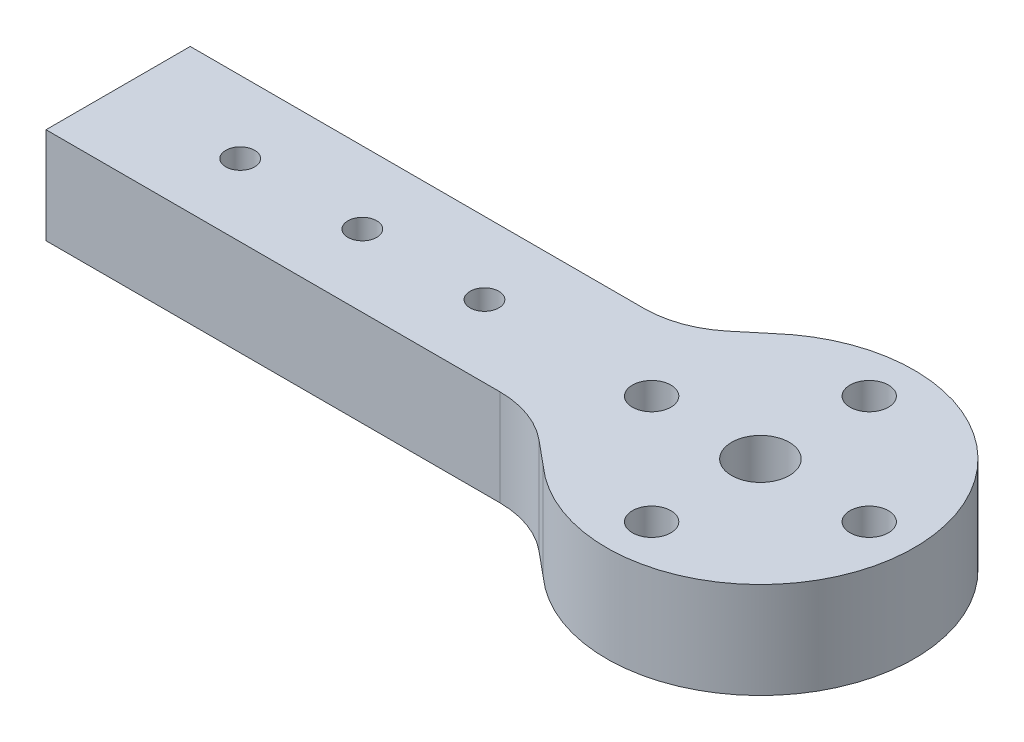
ISO-10303-21;
HEADER;
FILE_DESCRIPTION(('STEP AP214'),'2;1');
FILE_NAME('part.step','',(''),(''),'','','');
FILE_SCHEMA(('AUTOMOTIVE_DESIGN { 1 0 10303 214 1 1 1 1 }'));
ENDSEC;
DATA;
#1=APPLICATION_CONTEXT('core data for automotive mechanical design processes');
#2=APPLICATION_PROTOCOL_DEFINITION('international standard','automotive_design',2000,#1);
#3=PRODUCT_CONTEXT('',#1,'mechanical');
#4=PRODUCT('Part','Part','',(#3));
#5=PRODUCT_RELATED_PRODUCT_CATEGORY('part','',(#4));
#6=PRODUCT_DEFINITION_FORMATION('','',#4);
#7=PRODUCT_DEFINITION_CONTEXT('part definition',#1,'design');
#8=PRODUCT_DEFINITION('design','',#6,#7);
#9=PRODUCT_DEFINITION_SHAPE('','',#8);
#10=(LENGTH_UNIT() NAMED_UNIT(*) SI_UNIT(.MILLI.,.METRE.));
#11=(NAMED_UNIT(*) PLANE_ANGLE_UNIT() SI_UNIT($,.RADIAN.));
#12=(NAMED_UNIT(*) SI_UNIT($,.STERADIAN.) SOLID_ANGLE_UNIT());
#13=UNCERTAINTY_MEASURE_WITH_UNIT(LENGTH_MEASURE(1.E-05),#10,'distance_accuracy_value','');
#14=(GEOMETRIC_REPRESENTATION_CONTEXT(3) GLOBAL_UNCERTAINTY_ASSIGNED_CONTEXT((#13)) GLOBAL_UNIT_ASSIGNED_CONTEXT((#10,
#11,#12)) REPRESENTATION_CONTEXT('',''));
#15=CARTESIAN_POINT('',(0.,0.,0.));
#16=DIRECTION('',(0.,0.,1.));
#17=DIRECTION('',(1.,0.,0.));
#18=AXIS2_PLACEMENT_3D('',#15,#16,#17);
#19=CARTESIAN_POINT('',(20.7132446022363,10.,-24.9638603553524));
#20=DIRECTION('',(0.638546032386932,0.,-0.769583630623019));
#21=DIRECTION('',(-0.769583630623019,0.,-0.638546032386932));
#22=AXIS2_PLACEMENT_3D('',#19,#20,#21);
#23=PLANE('',#22);
#24=DIRECTION('',(0.769583630623019,0.,0.638546032386932));
#25=VECTOR('',#24,1.);
#26=CARTESIAN_POINT('',(20.7132446022363,0.,-24.9638603553524));
#27=LINE('',#26,#25);
#28=CARTESIAN_POINT('',(53.5770067795623,0.,2.3041636937698));
#29=VERTEX_POINT('',#28);
#30=CARTESIAN_POINT('',(56.126078820761,0.,4.41920327284473));
#31=VERTEX_POINT('',#30);
#32=EDGE_CURVE('E159',#29,#31,#27,.T.);
#33=ORIENTED_EDGE('',*,*,#32,.T.);
#34=DIRECTION('',(0.,-1.,0.));
#35=VECTOR('',#34,1.);
#36=CARTESIAN_POINT('',(56.126078820761,10.,4.41920327284473));
#37=LINE('',#36,#35);
#38=CARTESIAN_POINT('',(56.126078820761,10.,4.41920327284473));
#39=VERTEX_POINT('',#38);
#40=EDGE_CURVE('E11',#39,#31,#37,.T.);
#41=ORIENTED_EDGE('',*,*,#40,.F.);
#42=DIRECTION('',(0.769583630623019,0.,0.638546032386932));
#43=VECTOR('',#42,1.);
#44=CARTESIAN_POINT('',(20.7132446022363,10.,-24.9638603553524));
#45=LINE('',#44,#43);
#46=CARTESIAN_POINT('',(53.5770067795623,10.,2.3041636937698));
#47=VERTEX_POINT('',#46);
#48=EDGE_CURVE('E219',#47,#39,#45,.T.);
#49=ORIENTED_EDGE('',*,*,#48,.F.);
#50=DIRECTION('',(0.,-1.,0.));
#51=VECTOR('',#50,1.);
#52=CARTESIAN_POINT('',(53.5770067795623,10.,2.3041636937698));
#53=LINE('',#52,#51);
#54=EDGE_CURVE('E52',#47,#29,#53,.T.);
#55=ORIENTED_EDGE('',*,*,#54,.T.);
#56=EDGE_LOOP('',(#33,#41,#49,#55));
#57=FACE_BOUND('',#56,.T.);
#58=ADVANCED_FACE('F35',(#57),#23,.F.);
#59=CARTESIAN_POINT('',(66.8,10.,-7.5));
#60=DIRECTION('',(0.,-1.,0.));
#61=DIRECTION('',(0.,0.,-1.));
#62=AXIS2_PLACEMENT_3D('',#59,#60,#61);
#63=CYLINDRICAL_SURFACE('',#62,16.);
#64=CARTESIAN_POINT('',(66.8,0.,-7.5));
#65=DIRECTION('',(0.,1.,0.));
#66=DIRECTION('',(0.,0.,1.));
#67=AXIS2_PLACEMENT_3D('',#64,#65,#66);
#68=CIRCLE('',#67,16.);
#69=CARTESIAN_POINT('',(56.126078820761,0.,-19.4192032728447));
#70=VERTEX_POINT('',#69);
#71=EDGE_CURVE('E161',#31,#70,#68,.T.);
#72=ORIENTED_EDGE('',*,*,#71,.T.);
#73=DIRECTION('',(0.,-1.,0.));
#74=VECTOR('',#73,1.);
#75=CARTESIAN_POINT('',(56.126078820761,10.,-19.4192032728447));
#76=LINE('',#75,#74);
#77=CARTESIAN_POINT('',(56.126078820761,10.,-19.4192032728447));
#78=VERTEX_POINT('',#77);
#79=EDGE_CURVE('E44',#78,#70,#76,.T.);
#80=ORIENTED_EDGE('',*,*,#79,.F.);
#81=CARTESIAN_POINT('',(66.8,10.,-7.5));
#82=DIRECTION('',(0.,1.,0.));
#83=DIRECTION('',(0.,0.,1.));
#84=AXIS2_PLACEMENT_3D('',#81,#82,#83);
#85=CIRCLE('',#84,16.);
#86=EDGE_CURVE('E91',#39,#78,#85,.T.);
#87=ORIENTED_EDGE('',*,*,#86,.F.);
#88=ORIENTED_EDGE('',*,*,#40,.T.);
#89=EDGE_LOOP('',(#72,#80,#87,#88));
#90=FACE_BOUND('',#89,.T.);
#91=ADVANCED_FACE('F207',(#90),#63,.T.);
#92=CARTESIAN_POINT('',(13.3420259933725,10.,16.0799758875088));
#93=DIRECTION('',(-0.638546032386932,0.,-0.769583630623019));
#94=DIRECTION('',(-0.769583630623019,0.,0.638546032386932));
#95=AXIS2_PLACEMENT_3D('',#92,#93,#94);
#96=PLANE('',#95);
#97=DIRECTION('',(0.769583630623019,0.,-0.638546032386932));
#98=VECTOR('',#97,1.);
#99=CARTESIAN_POINT('',(13.3420259933725,0.,16.0799758875088));
#100=LINE('',#99,#98);
#101=CARTESIAN_POINT('',(53.5770067795623,0.,-17.3041636937698));
#102=VERTEX_POINT('',#101);
#103=EDGE_CURVE('E164',#102,#70,#100,.T.);
#104=ORIENTED_EDGE('',*,*,#103,.F.);
#105=DIRECTION('',(0.,-1.,0.));
#106=VECTOR('',#105,1.);
#107=CARTESIAN_POINT('',(53.5770067795623,10.,-17.3041636937698));
#108=LINE('',#107,#106);
#109=CARTESIAN_POINT('',(53.5770067795623,10.,-17.3041636937698));
#110=VERTEX_POINT('',#109);
#111=EDGE_CURVE('E200',#110,#102,#108,.T.);
#112=ORIENTED_EDGE('',*,*,#111,.F.);
#113=DIRECTION('',(0.769583630623019,0.,-0.638546032386932));
#114=VECTOR('',#113,1.);
#115=CARTESIAN_POINT('',(13.3420259933725,10.,16.0799758875088));
#116=LINE('',#115,#114);
#117=EDGE_CURVE('E206',#110,#78,#116,.T.);
#118=ORIENTED_EDGE('',*,*,#117,.T.);
#119=ORIENTED_EDGE('',*,*,#79,.T.);
#120=EDGE_LOOP('',(#104,#112,#118,#119));
#121=FACE_BOUND('',#120,.T.);
#122=ADVANCED_FACE('F204',(#121),#96,.T.);
#123=CARTESIAN_POINT('',(47.191546455693,10.,-25.));
#124=DIRECTION('',(0.,-1.,0.));
#125=DIRECTION('',(0.,0.,-1.));
#126=AXIS2_PLACEMENT_3D('',#123,#124,#125);
#127=CYLINDRICAL_SURFACE('',#126,10.);
#128=CARTESIAN_POINT('',(47.191546455693,0.,-25.));
#129=DIRECTION('',(0.,1.,0.));
#130=DIRECTION('',(0.,0.,1.));
#131=AXIS2_PLACEMENT_3D('',#128,#129,#130);
#132=CIRCLE('',#131,10.);
#133=CARTESIAN_POINT('',(47.191546455693,0.,-15.));
#134=VERTEX_POINT('',#133);
#135=EDGE_CURVE('E167',#102,#134,#132,.F.);
#136=ORIENTED_EDGE('',*,*,#135,.T.);
#137=DIRECTION('',(0.,-1.,0.));
#138=VECTOR('',#137,1.);
#139=CARTESIAN_POINT('',(47.191546455693,10.,-15.));
#140=LINE('',#139,#138);
#141=CARTESIAN_POINT('',(47.191546455693,10.,-15.));
#142=VERTEX_POINT('',#141);
#143=EDGE_CURVE('E198',#142,#134,#140,.T.);
#144=ORIENTED_EDGE('',*,*,#143,.F.);
#145=CARTESIAN_POINT('',(47.191546455693,10.,-25.));
#146=DIRECTION('',(0.,1.,0.));
#147=DIRECTION('',(0.,0.,1.));
#148=AXIS2_PLACEMENT_3D('',#145,#146,#147);
#149=CIRCLE('',#148,10.);
#150=EDGE_CURVE('E130',#110,#142,#149,.F.);
#151=ORIENTED_EDGE('',*,*,#150,.F.);
#152=ORIENTED_EDGE('',*,*,#111,.T.);
#153=EDGE_LOOP('',(#136,#144,#151,#152));
#154=FACE_BOUND('',#153,.T.);
#155=ADVANCED_FACE('F216',(#154),#127,.F.);
#156=CARTESIAN_POINT('',(0.,10.,-15.));
#157=DIRECTION('',(0.,0.,-1.));
#158=DIRECTION('',(-1.,0.,0.));
#159=AXIS2_PLACEMENT_3D('',#156,#157,#158);
#160=PLANE('',#159);
#161=DIRECTION('',(1.,0.,0.));
#162=VECTOR('',#161,1.);
#163=CARTESIAN_POINT('',(0.,0.,-15.));
#164=LINE('',#163,#162);
#165=CARTESIAN_POINT('',(0.,0.,-15.));
#166=VERTEX_POINT('',#165);
#167=EDGE_CURVE('E170',#166,#134,#164,.T.);
#168=ORIENTED_EDGE('',*,*,#167,.F.);
#169=DIRECTION('',(0.,-1.,0.));
#170=VECTOR('',#169,1.);
#171=CARTESIAN_POINT('',(0.,10.,-15.));
#172=LINE('',#171,#170);
#173=CARTESIAN_POINT('',(0.,10.,-15.));
#174=VERTEX_POINT('',#173);
#175=EDGE_CURVE('E116',#174,#166,#172,.T.);
#176=ORIENTED_EDGE('',*,*,#175,.F.);
#177=DIRECTION('',(1.,0.,0.));
#178=VECTOR('',#177,1.);
#179=CARTESIAN_POINT('',(0.,10.,-15.));
#180=LINE('',#179,#178);
#181=EDGE_CURVE('E128',#174,#142,#180,.T.);
#182=ORIENTED_EDGE('',*,*,#181,.T.);
#183=ORIENTED_EDGE('',*,*,#143,.T.);
#184=EDGE_LOOP('',(#168,#176,#182,#183));
#185=FACE_BOUND('',#184,.T.);
#186=ADVANCED_FACE('F301',(#185),#160,.T.);
#187=CARTESIAN_POINT('',(0.,10.,0.));
#188=DIRECTION('',(-1.,0.,0.));
#189=DIRECTION('',(0.,0.,1.));
#190=AXIS2_PLACEMENT_3D('',#187,#188,#189);
#191=PLANE('',#190);
#192=DIRECTION('',(0.,0.,-1.));
#193=VECTOR('',#192,1.);
#194=CARTESIAN_POINT('',(0.,0.,0.));
#195=LINE('',#194,#193);
#196=CARTESIAN_POINT('',(0.,0.,0.));
#197=VERTEX_POINT('',#196);
#198=EDGE_CURVE('E113',#197,#166,#195,.T.);
#199=ORIENTED_EDGE('',*,*,#198,.F.);
#200=DIRECTION('',(0.,-1.,0.));
#201=VECTOR('',#200,1.);
#202=CARTESIAN_POINT('',(0.,10.,0.));
#203=LINE('',#202,#201);
#204=CARTESIAN_POINT('',(0.,10.,0.));
#205=VERTEX_POINT('',#204);
#206=EDGE_CURVE('E107',#205,#197,#203,.T.);
#207=ORIENTED_EDGE('',*,*,#206,.F.);
#208=DIRECTION('',(0.,0.,-1.));
#209=VECTOR('',#208,1.);
#210=CARTESIAN_POINT('',(0.,10.,0.));
#211=LINE('',#210,#209);
#212=EDGE_CURVE('E111',#205,#174,#211,.T.);
#213=ORIENTED_EDGE('',*,*,#212,.T.);
#214=ORIENTED_EDGE('',*,*,#175,.T.);
#215=EDGE_LOOP('',(#199,#207,#213,#214));
#216=FACE_BOUND('',#215,.T.);
#217=ADVANCED_FACE('F109',(#216),#191,.T.);
#218=CARTESIAN_POINT('',(0.,10.,0.));
#219=DIRECTION('',(0.,0.,-1.));
#220=DIRECTION('',(-1.,0.,0.));
#221=AXIS2_PLACEMENT_3D('',#218,#219,#220);
#222=PLANE('',#221);
#223=DIRECTION('',(1.,0.,0.));
#224=VECTOR('',#223,1.);
#225=CARTESIAN_POINT('',(0.,0.,0.));
#226=LINE('',#225,#224);
#227=CARTESIAN_POINT('',(47.191546455693,0.,0.));
#228=VERTEX_POINT('',#227);
#229=EDGE_CURVE('E174',#197,#228,#226,.T.);
#230=ORIENTED_EDGE('',*,*,#229,.T.);
#231=DIRECTION('',(0.,-1.,0.));
#232=VECTOR('',#231,1.);
#233=CARTESIAN_POINT('',(47.191546455693,10.,0.));
#234=LINE('',#233,#232);
#235=CARTESIAN_POINT('',(47.191546455693,10.,0.));
#236=VERTEX_POINT('',#235);
#237=EDGE_CURVE('E79',#236,#228,#234,.T.);
#238=ORIENTED_EDGE('',*,*,#237,.F.);
#239=DIRECTION('',(1.,0.,0.));
#240=VECTOR('',#239,1.);
#241=CARTESIAN_POINT('',(0.,10.,0.));
#242=LINE('',#241,#240);
#243=EDGE_CURVE('E118',#205,#236,#242,.T.);
#244=ORIENTED_EDGE('',*,*,#243,.F.);
#245=ORIENTED_EDGE('',*,*,#206,.T.);
#246=EDGE_LOOP('',(#230,#238,#244,#245));
#247=FACE_BOUND('',#246,.T.);
#248=ADVANCED_FACE('F119',(#247),#222,.F.);
#249=CARTESIAN_POINT('',(78.1137085,10.,-7.5));
#250=DIRECTION('',(0.,-1.,0.));
#251=DIRECTION('',(0.,0.,-1.));
#252=AXIS2_PLACEMENT_3D('',#249,#250,#251);
#253=CYLINDRICAL_SURFACE('',#252,2.);
#254=CARTESIAN_POINT('',(78.1137085,10.,-7.5));
#255=DIRECTION('',(0.,1.,0.));
#256=DIRECTION('',(0.,0.,1.));
#257=AXIS2_PLACEMENT_3D('',#254,#255,#256);
#258=CIRCLE('',#257,2.);
#259=CARTESIAN_POINT('',(78.1137085,10.,-5.5));
#260=VERTEX_POINT('',#259);
#261=EDGE_CURVE('E144',#260,#260,#258,.T.);
#262=ORIENTED_EDGE('',*,*,#261,.T.);
#263=EDGE_LOOP('',(#262));
#264=FACE_BOUND('',#263,.T.);
#265=CARTESIAN_POINT('',(78.1137085,0.,-7.5));
#266=DIRECTION('',(0.,1.,0.));
#267=DIRECTION('',(0.,0.,1.));
#268=AXIS2_PLACEMENT_3D('',#265,#266,#267);
#269=CIRCLE('',#268,2.);
#270=CARTESIAN_POINT('',(78.1137085,0.,-5.5));
#271=VERTEX_POINT('',#270);
#272=EDGE_CURVE('E188',#271,#271,#269,.T.);
#273=ORIENTED_EDGE('',*,*,#272,.F.);
#274=EDGE_LOOP('',(#273));
#275=FACE_BOUND('',#274,.T.);
#276=ADVANCED_FACE('F279',(#264,#275),#253,.F.);
#277=CARTESIAN_POINT('',(25.4,10.,-7.5));
#278=DIRECTION('',(0.,-1.,0.));
#279=DIRECTION('',(0.,0.,-1.));
#280=AXIS2_PLACEMENT_3D('',#277,#278,#279);
#281=CYLINDRICAL_SURFACE('',#280,1.5);
#282=CARTESIAN_POINT('',(25.4,10.,-7.5));
#283=DIRECTION('',(0.,1.,0.));
#284=DIRECTION('',(0.,0.,1.));
#285=AXIS2_PLACEMENT_3D('',#282,#283,#284);
#286=CIRCLE('',#285,1.5);
#287=CARTESIAN_POINT('',(25.4,10.,-6.));
#288=VERTEX_POINT('',#287);
#289=EDGE_CURVE('E141',#288,#288,#286,.T.);
#290=ORIENTED_EDGE('',*,*,#289,.T.);
#291=EDGE_LOOP('',(#290));
#292=FACE_BOUND('',#291,.T.);
#293=CARTESIAN_POINT('',(25.4,0.,-7.5));
#294=DIRECTION('',(0.,1.,0.));
#295=DIRECTION('',(0.,0.,1.));
#296=AXIS2_PLACEMENT_3D('',#293,#294,#295);
#297=CIRCLE('',#296,1.5);
#298=CARTESIAN_POINT('',(25.4,0.,-6.));
#299=VERTEX_POINT('',#298);
#300=EDGE_CURVE('E185',#299,#299,#297,.T.);
#301=ORIENTED_EDGE('',*,*,#300,.F.);
#302=EDGE_LOOP('',(#301));
#303=FACE_BOUND('',#302,.T.);
#304=ADVANCED_FACE('F282',(#292,#303),#281,.F.);
#305=CARTESIAN_POINT('',(38.1,10.,-7.5));
#306=DIRECTION('',(0.,-1.,0.));
#307=DIRECTION('',(0.,0.,-1.));
#308=AXIS2_PLACEMENT_3D('',#305,#306,#307);
#309=CYLINDRICAL_SURFACE('',#308,1.5);
#310=CARTESIAN_POINT('',(38.1,10.,-7.5));
#311=DIRECTION('',(0.,1.,0.));
#312=DIRECTION('',(0.,0.,1.));
#313=AXIS2_PLACEMENT_3D('',#310,#311,#312);
#314=CIRCLE('',#313,1.5);
#315=CARTESIAN_POINT('',(38.1,10.,-6.));
#316=VERTEX_POINT('',#315);
#317=EDGE_CURVE('E138',#316,#316,#314,.T.);
#318=ORIENTED_EDGE('',*,*,#317,.T.);
#319=EDGE_LOOP('',(#318));
#320=FACE_BOUND('',#319,.T.);
#321=CARTESIAN_POINT('',(38.1,0.,-7.5));
#322=DIRECTION('',(0.,1.,0.));
#323=DIRECTION('',(0.,0.,1.));
#324=AXIS2_PLACEMENT_3D('',#321,#322,#323);
#325=CIRCLE('',#324,1.5);
#326=CARTESIAN_POINT('',(38.1,0.,-6.));
#327=VERTEX_POINT('',#326);
#328=EDGE_CURVE('E182',#327,#327,#325,.T.);
#329=ORIENTED_EDGE('',*,*,#328,.F.);
#330=EDGE_LOOP('',(#329));
#331=FACE_BOUND('',#330,.T.);
#332=ADVANCED_FACE('F286',(#320,#331),#309,.F.);
#333=CARTESIAN_POINT('',(12.7,10.,-7.5));
#334=DIRECTION('',(0.,-1.,0.));
#335=DIRECTION('',(0.,0.,-1.));
#336=AXIS2_PLACEMENT_3D('',#333,#334,#335);
#337=CYLINDRICAL_SURFACE('',#336,1.5);
#338=CARTESIAN_POINT('',(12.7,10.,-7.5));
#339=DIRECTION('',(0.,1.,0.));
#340=DIRECTION('',(0.,0.,1.));
#341=AXIS2_PLACEMENT_3D('',#338,#339,#340);
#342=CIRCLE('',#341,1.5);
#343=CARTESIAN_POINT('',(12.7,10.,-6.));
#344=VERTEX_POINT('',#343);
#345=EDGE_CURVE('E135',#344,#344,#342,.T.);
#346=ORIENTED_EDGE('',*,*,#345,.T.);
#347=EDGE_LOOP('',(#346));
#348=FACE_BOUND('',#347,.T.);
#349=CARTESIAN_POINT('',(12.7,0.,-7.5));
#350=DIRECTION('',(0.,1.,0.));
#351=DIRECTION('',(0.,0.,1.));
#352=AXIS2_PLACEMENT_3D('',#349,#350,#351);
#353=CIRCLE('',#352,1.5);
#354=CARTESIAN_POINT('',(12.7,0.,-6.));
#355=VERTEX_POINT('',#354);
#356=EDGE_CURVE('E179',#355,#355,#353,.T.);
#357=ORIENTED_EDGE('',*,*,#356,.F.);
#358=EDGE_LOOP('',(#357));
#359=FACE_BOUND('',#358,.T.);
#360=ADVANCED_FACE('F290',(#348,#359),#337,.F.);
#361=CARTESIAN_POINT('',(47.191546455693,10.,10.));
#362=DIRECTION('',(0.,-1.,0.));
#363=DIRECTION('',(0.,0.,-1.));
#364=AXIS2_PLACEMENT_3D('',#361,#362,#363);
#365=CYLINDRICAL_SURFACE('',#364,10.);
#366=CARTESIAN_POINT('',(47.191546455693,0.,10.));
#367=DIRECTION('',(0.,1.,0.));
#368=DIRECTION('',(0.,0.,1.));
#369=AXIS2_PLACEMENT_3D('',#366,#367,#368);
#370=CIRCLE('',#369,10.);
#371=EDGE_CURVE('E176',#29,#228,#370,.T.);
#372=ORIENTED_EDGE('',*,*,#371,.F.);
#373=ORIENTED_EDGE('',*,*,#54,.F.);
#374=CARTESIAN_POINT('',(47.191546455693,10.,10.));
#375=DIRECTION('',(0.,1.,0.));
#376=DIRECTION('',(0.,0.,1.));
#377=AXIS2_PLACEMENT_3D('',#374,#375,#376);
#378=CIRCLE('',#377,10.);
#379=EDGE_CURVE('E122',#47,#236,#378,.T.);
#380=ORIENTED_EDGE('',*,*,#379,.T.);
#381=ORIENTED_EDGE('',*,*,#237,.T.);
#382=EDGE_LOOP('',(#372,#373,#380,#381));
#383=FACE_BOUND('',#382,.T.);
#384=ADVANCED_FACE('F246',(#383),#365,.F.);
#385=CARTESIAN_POINT('',(66.8,10.,-18.8137085));
#386=DIRECTION('',(0.,-1.,0.));
#387=DIRECTION('',(0.,0.,-1.));
#388=AXIS2_PLACEMENT_3D('',#385,#386,#387);
#389=CYLINDRICAL_SURFACE('',#388,2.);
#390=CARTESIAN_POINT('',(66.8,10.,-18.8137085));
#391=DIRECTION('',(0.,1.,0.));
#392=DIRECTION('',(0.,0.,1.));
#393=AXIS2_PLACEMENT_3D('',#390,#391,#392);
#394=CIRCLE('',#393,2.);
#395=CARTESIAN_POINT('',(66.8,10.,-16.8137085));
#396=VERTEX_POINT('',#395);
#397=EDGE_CURVE('E223',#396,#396,#394,.T.);
#398=ORIENTED_EDGE('',*,*,#397,.T.);
#399=EDGE_LOOP('',(#398));
#400=FACE_BOUND('',#399,.T.);
#401=CARTESIAN_POINT('',(66.8,0.,-18.8137085));
#402=DIRECTION('',(0.,1.,0.));
#403=DIRECTION('',(0.,0.,1.));
#404=AXIS2_PLACEMENT_3D('',#401,#402,#403);
#405=CIRCLE('',#404,2.);
#406=CARTESIAN_POINT('',(66.8,0.,-16.8137085));
#407=VERTEX_POINT('',#406);
#408=EDGE_CURVE('E156',#407,#407,#405,.T.);
#409=ORIENTED_EDGE('',*,*,#408,.F.);
#410=EDGE_LOOP('',(#409));
#411=FACE_BOUND('',#410,.T.);
#412=ADVANCED_FACE('F242',(#400,#411),#389,.F.);
#413=CARTESIAN_POINT('',(55.4862915,10.,-7.5));
#414=DIRECTION('',(0.,-1.,0.));
#415=DIRECTION('',(0.,0.,-1.));
#416=AXIS2_PLACEMENT_3D('',#413,#414,#415);
#417=CYLINDRICAL_SURFACE('',#416,2.);
#418=CARTESIAN_POINT('',(55.4862915,10.,-7.5));
#419=DIRECTION('',(0.,1.,0.));
#420=DIRECTION('',(0.,0.,1.));
#421=AXIS2_PLACEMENT_3D('',#418,#419,#420);
#422=CIRCLE('',#421,2.);
#423=CARTESIAN_POINT('',(55.4862915,10.,-5.5));
#424=VERTEX_POINT('',#423);
#425=EDGE_CURVE('E226',#424,#424,#422,.T.);
#426=ORIENTED_EDGE('',*,*,#425,.T.);
#427=EDGE_LOOP('',(#426));
#428=FACE_BOUND('',#427,.T.);
#429=CARTESIAN_POINT('',(55.4862915,0.,-7.5));
#430=DIRECTION('',(0.,1.,0.));
#431=DIRECTION('',(0.,0.,1.));
#432=AXIS2_PLACEMENT_3D('',#429,#430,#431);
#433=CIRCLE('',#432,2.);
#434=CARTESIAN_POINT('',(55.4862915,0.,-5.5));
#435=VERTEX_POINT('',#434);
#436=EDGE_CURVE('E153',#435,#435,#433,.T.);
#437=ORIENTED_EDGE('',*,*,#436,.F.);
#438=EDGE_LOOP('',(#437));
#439=FACE_BOUND('',#438,.T.);
#440=ADVANCED_FACE('F245',(#428,#439),#417,.F.);
#441=CARTESIAN_POINT('',(66.8,10.,3.81370850000001));
#442=DIRECTION('',(0.,-1.,0.));
#443=DIRECTION('',(0.,0.,-1.));
#444=AXIS2_PLACEMENT_3D('',#441,#442,#443);
#445=CYLINDRICAL_SURFACE('',#444,2.);
#446=CARTESIAN_POINT('',(66.8,10.,3.81370850000001));
#447=DIRECTION('',(0.,1.,0.));
#448=DIRECTION('',(0.,0.,1.));
#449=AXIS2_PLACEMENT_3D('',#446,#447,#448);
#450=CIRCLE('',#449,2.);
#451=CARTESIAN_POINT('',(66.8,10.,5.8137085));
#452=VERTEX_POINT('',#451);
#453=EDGE_CURVE('E194',#452,#452,#450,.T.);
#454=ORIENTED_EDGE('',*,*,#453,.T.);
#455=EDGE_LOOP('',(#454));
#456=FACE_BOUND('',#455,.T.);
#457=CARTESIAN_POINT('',(66.8,0.,3.81370850000001));
#458=DIRECTION('',(0.,1.,0.));
#459=DIRECTION('',(0.,0.,1.));
#460=AXIS2_PLACEMENT_3D('',#457,#458,#459);
#461=CIRCLE('',#460,2.);
#462=CARTESIAN_POINT('',(66.8,0.,5.8137085));
#463=VERTEX_POINT('',#462);
#464=EDGE_CURVE('E150',#463,#463,#461,.T.);
#465=ORIENTED_EDGE('',*,*,#464,.F.);
#466=EDGE_LOOP('',(#465));
#467=FACE_BOUND('',#466,.T.);
#468=ADVANCED_FACE('F37',(#456,#467),#445,.F.);
#469=CARTESIAN_POINT('',(66.8,10.,-7.5));
#470=DIRECTION('',(0.,-1.,0.));
#471=DIRECTION('',(0.,0.,-1.));
#472=AXIS2_PLACEMENT_3D('',#469,#470,#471);
#473=CYLINDRICAL_SURFACE('',#472,3.00000000000001);
#474=CARTESIAN_POINT('',(66.8,10.,-7.5));
#475=DIRECTION('',(0.,1.,0.));
#476=DIRECTION('',(0.,0.,1.));
#477=AXIS2_PLACEMENT_3D('',#474,#475,#476);
#478=CIRCLE('',#477,3.00000000000001);
#479=CARTESIAN_POINT('',(66.8,10.,-4.49999999999999));
#480=VERTEX_POINT('',#479);
#481=EDGE_CURVE('E147',#480,#480,#478,.T.);
#482=ORIENTED_EDGE('',*,*,#481,.T.);
#483=EDGE_LOOP('',(#482));
#484=FACE_BOUND('',#483,.T.);
#485=CARTESIAN_POINT('',(66.8,0.,-7.5));
#486=DIRECTION('',(0.,1.,0.));
#487=DIRECTION('',(0.,0.,1.));
#488=AXIS2_PLACEMENT_3D('',#485,#486,#487);
#489=CIRCLE('',#488,3.00000000000001);
#490=CARTESIAN_POINT('',(66.8,0.,-4.49999999999999));
#491=VERTEX_POINT('',#490);
#492=EDGE_CURVE('E191',#491,#491,#489,.T.);
#493=ORIENTED_EDGE('',*,*,#492,.F.);
#494=EDGE_LOOP('',(#493));
#495=FACE_BOUND('',#494,.T.);
#496=ADVANCED_FACE('F236',(#484,#495),#473,.F.);
#497=CARTESIAN_POINT('',(0.,10.,0.));
#498=DIRECTION('',(0.,1.,0.));
#499=DIRECTION('',(0.,0.,1.));
#500=AXIS2_PLACEMENT_3D('',#497,#498,#499);
#501=PLANE('',#500);
#502=ORIENTED_EDGE('',*,*,#453,.F.);
#503=EDGE_LOOP('',(#502));
#504=FACE_BOUND('',#503,.T.);
#505=ORIENTED_EDGE('',*,*,#425,.F.);
#506=EDGE_LOOP('',(#505));
#507=FACE_BOUND('',#506,.T.);
#508=ORIENTED_EDGE('',*,*,#397,.F.);
#509=EDGE_LOOP('',(#508));
#510=FACE_BOUND('',#509,.T.);
#511=ORIENTED_EDGE('',*,*,#48,.T.);
#512=ORIENTED_EDGE('',*,*,#86,.T.);
#513=ORIENTED_EDGE('',*,*,#117,.F.);
#514=ORIENTED_EDGE('',*,*,#150,.T.);
#515=ORIENTED_EDGE('',*,*,#181,.F.);
#516=ORIENTED_EDGE('',*,*,#212,.F.);
#517=ORIENTED_EDGE('',*,*,#243,.T.);
#518=ORIENTED_EDGE('',*,*,#379,.F.);
#519=EDGE_LOOP('',(#511,#512,#513,#514,#515,#516,#517,#518));
#520=FACE_BOUND('',#519,.T.);
#521=ORIENTED_EDGE('',*,*,#345,.F.);
#522=EDGE_LOOP('',(#521));
#523=FACE_BOUND('',#522,.T.);
#524=ORIENTED_EDGE('',*,*,#317,.F.);
#525=EDGE_LOOP('',(#524));
#526=FACE_BOUND('',#525,.T.);
#527=ORIENTED_EDGE('',*,*,#289,.F.);
#528=EDGE_LOOP('',(#527));
#529=FACE_BOUND('',#528,.T.);
#530=ORIENTED_EDGE('',*,*,#261,.F.);
#531=EDGE_LOOP('',(#530));
#532=FACE_BOUND('',#531,.T.);
#533=ORIENTED_EDGE('',*,*,#481,.F.);
#534=EDGE_LOOP('',(#533));
#535=FACE_BOUND('',#534,.T.);
#536=ADVANCED_FACE('F125',(#504,#507,#510,#520,#523,#526,#529,#532,#535),#501,.T.);
#537=CARTESIAN_POINT('',(0.,0.,0.));
#538=DIRECTION('',(0.,1.,0.));
#539=DIRECTION('',(0.,0.,1.));
#540=AXIS2_PLACEMENT_3D('',#537,#538,#539);
#541=PLANE('',#540);
#542=ORIENTED_EDGE('',*,*,#464,.T.);
#543=EDGE_LOOP('',(#542));
#544=FACE_BOUND('',#543,.T.);
#545=ORIENTED_EDGE('',*,*,#436,.T.);
#546=EDGE_LOOP('',(#545));
#547=FACE_BOUND('',#546,.T.);
#548=ORIENTED_EDGE('',*,*,#408,.T.);
#549=EDGE_LOOP('',(#548));
#550=FACE_BOUND('',#549,.T.);
#551=ORIENTED_EDGE('',*,*,#32,.F.);
#552=ORIENTED_EDGE('',*,*,#371,.T.);
#553=ORIENTED_EDGE('',*,*,#229,.F.);
#554=ORIENTED_EDGE('',*,*,#198,.T.);
#555=ORIENTED_EDGE('',*,*,#167,.T.);
#556=ORIENTED_EDGE('',*,*,#135,.F.);
#557=ORIENTED_EDGE('',*,*,#103,.T.);
#558=ORIENTED_EDGE('',*,*,#71,.F.);
#559=EDGE_LOOP('',(#551,#552,#553,#554,#555,#556,#557,#558));
#560=FACE_BOUND('',#559,.T.);
#561=ORIENTED_EDGE('',*,*,#356,.T.);
#562=EDGE_LOOP('',(#561));
#563=FACE_BOUND('',#562,.T.);
#564=ORIENTED_EDGE('',*,*,#328,.T.);
#565=EDGE_LOOP('',(#564));
#566=FACE_BOUND('',#565,.T.);
#567=ORIENTED_EDGE('',*,*,#300,.T.);
#568=EDGE_LOOP('',(#567));
#569=FACE_BOUND('',#568,.T.);
#570=ORIENTED_EDGE('',*,*,#272,.T.);
#571=EDGE_LOOP('',(#570));
#572=FACE_BOUND('',#571,.T.);
#573=ORIENTED_EDGE('',*,*,#492,.T.);
#574=EDGE_LOOP('',(#573));
#575=FACE_BOUND('',#574,.T.);
#576=ADVANCED_FACE('F211',(#544,#547,#550,#560,#563,#566,#569,#572,#575),#541,.F.);
#577=CLOSED_SHELL('',(#58,#91,#122,#155,#186,#217,#248,#276,#304,#332,#360,#384,#412,#440,#468,
#496,#536,#576));
#578=MANIFOLD_SOLID_BREP('B2',#577);
#579=ADVANCED_BREP_SHAPE_REPRESENTATION('',(#18,#578),#14);
#580=SHAPE_DEFINITION_REPRESENTATION(#9,#579);
ENDSEC;
END-ISO-10303-21;
